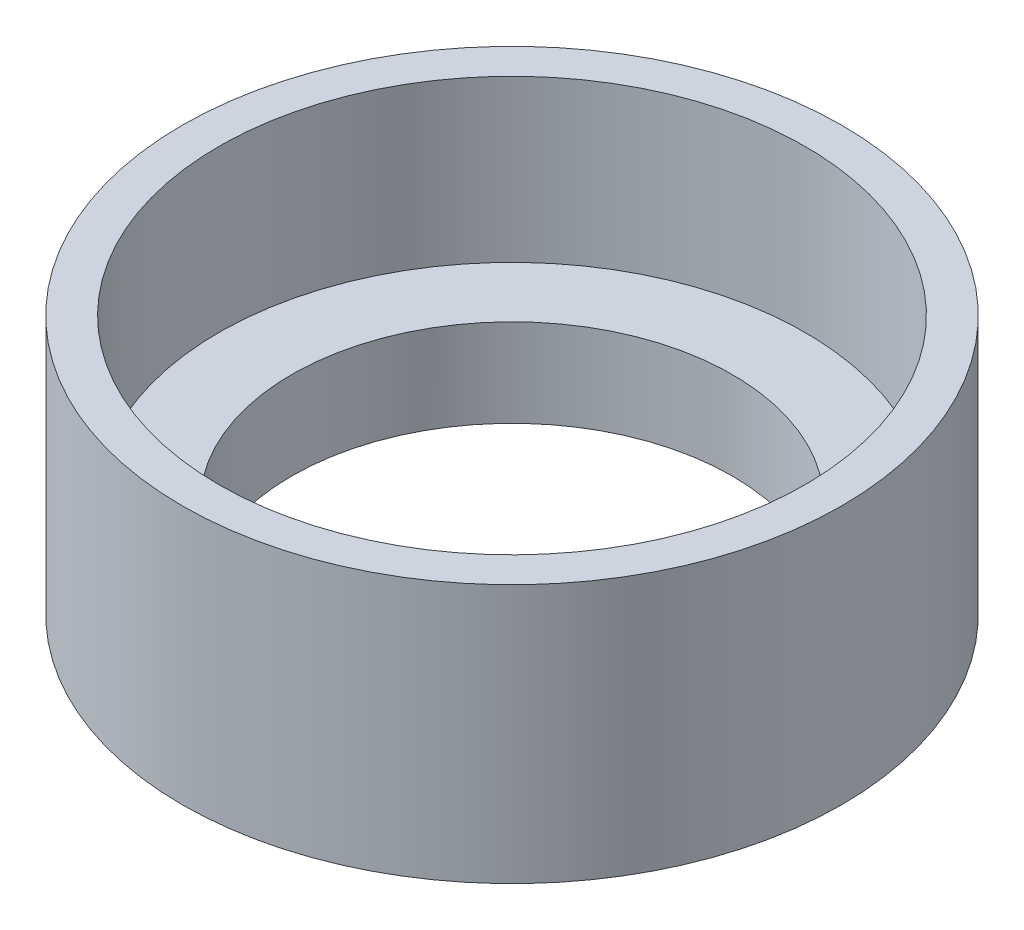
ISO-10303-21;
HEADER;
FILE_DESCRIPTION(('STEP AP214'),'2;1');
FILE_NAME('part.step','',(''),(''),'','','');
FILE_SCHEMA(('AUTOMOTIVE_DESIGN { 1 0 10303 214 1 1 1 1 }'));
ENDSEC;
DATA;
#1=APPLICATION_CONTEXT('core data for automotive mechanical design processes');
#2=APPLICATION_PROTOCOL_DEFINITION('international standard','automotive_design',2000,#1);
#3=PRODUCT_CONTEXT('',#1,'mechanical');
#4=PRODUCT('Part','Part','',(#3));
#5=PRODUCT_RELATED_PRODUCT_CATEGORY('part','',(#4));
#6=PRODUCT_DEFINITION_FORMATION('','',#4);
#7=PRODUCT_DEFINITION_CONTEXT('part definition',#1,'design');
#8=PRODUCT_DEFINITION('design','',#6,#7);
#9=PRODUCT_DEFINITION_SHAPE('','',#8);
#10=(LENGTH_UNIT() NAMED_UNIT(*) SI_UNIT(.MILLI.,.METRE.));
#11=(NAMED_UNIT(*) PLANE_ANGLE_UNIT() SI_UNIT($,.RADIAN.));
#12=(NAMED_UNIT(*) SI_UNIT($,.STERADIAN.) SOLID_ANGLE_UNIT());
#13=UNCERTAINTY_MEASURE_WITH_UNIT(LENGTH_MEASURE(1.E-05),#10,'distance_accuracy_value','');
#14=(GEOMETRIC_REPRESENTATION_CONTEXT(3) GLOBAL_UNCERTAINTY_ASSIGNED_CONTEXT((#13)) GLOBAL_UNIT_ASSIGNED_CONTEXT((#10,
#11,#12)) REPRESENTATION_CONTEXT('',''));
#15=CARTESIAN_POINT('',(0.,0.,0.));
#16=DIRECTION('',(0.,0.,1.));
#17=DIRECTION('',(1.,0.,0.));
#18=AXIS2_PLACEMENT_3D('',#15,#16,#17);
#19=CARTESIAN_POINT('',(0.,20.,0.));
#20=DIRECTION('',(0.,-1.,0.));
#21=DIRECTION('',(0.,0.,-1.));
#22=AXIS2_PLACEMENT_3D('',#19,#20,#21);
#23=PLANE('',#22);
#24=CARTESIAN_POINT('',(0.,20.,0.));
#25=DIRECTION('',(0.,-1.,0.));
#26=DIRECTION('',(0.,0.,-1.));
#27=AXIS2_PLACEMENT_3D('',#24,#25,#26);
#28=CIRCLE('',#27,60.);
#29=CARTESIAN_POINT('',(0.,20.,60.));
#30=VERTEX_POINT('',#29);
#31=EDGE_CURVE('E47',#30,#30,#28,.T.);
#32=ORIENTED_EDGE('',*,*,#31,.F.);
#33=EDGE_LOOP('',(#32));
#34=FACE_BOUND('',#33,.T.);
#35=CARTESIAN_POINT('',(0.,20.,0.));
#36=DIRECTION('',(0.,1.,0.));
#37=DIRECTION('',(0.,0.,1.));
#38=AXIS2_PLACEMENT_3D('',#35,#36,#37);
#39=CIRCLE('',#38,45.1);
#40=CARTESIAN_POINT('',(0.,20.,45.1));
#41=VERTEX_POINT('',#40);
#42=EDGE_CURVE('E72',#41,#41,#39,.T.);
#43=ORIENTED_EDGE('',*,*,#42,.F.);
#44=EDGE_LOOP('',(#43));
#45=FACE_BOUND('',#44,.T.);
#46=ADVANCED_FACE('F40',(#34,#45),#23,.F.);
#47=CARTESIAN_POINT('',(0.,16.,0.));
#48=DIRECTION('',(0.,-1.,0.));
#49=DIRECTION('',(0.,0.,-1.));
#50=AXIS2_PLACEMENT_3D('',#47,#48,#49);
#51=PLANE('',#50);
#52=CARTESIAN_POINT('',(0.,16.,0.));
#53=DIRECTION('',(0.,-1.,0.));
#54=DIRECTION('',(0.,0.,-1.));
#55=AXIS2_PLACEMENT_3D('',#52,#53,#54);
#56=CIRCLE('',#55,47.65);
#57=CARTESIAN_POINT('',(0.,16.,-47.65));
#58=VERTEX_POINT('',#57);
#59=EDGE_CURVE('E10',#58,#58,#56,.T.);
#60=ORIENTED_EDGE('',*,*,#59,.F.);
#61=EDGE_LOOP('',(#60));
#62=FACE_BOUND('',#61,.T.);
#63=CARTESIAN_POINT('',(0.,16.,0.));
#64=DIRECTION('',(0.,-1.,0.));
#65=DIRECTION('',(0.,0.,-1.));
#66=AXIS2_PLACEMENT_3D('',#63,#64,#65);
#67=CIRCLE('',#66,60.);
#68=CARTESIAN_POINT('',(0.,16.,60.));
#69=VERTEX_POINT('',#68);
#70=EDGE_CURVE('E63',#69,#69,#67,.T.);
#71=ORIENTED_EDGE('',*,*,#70,.T.);
#72=EDGE_LOOP('',(#71));
#73=FACE_BOUND('',#72,.T.);
#74=ADVANCED_FACE('F97',(#62,#73),#51,.T.);
#75=CARTESIAN_POINT('',(0.,-176.211009871688,0.));
#76=DIRECTION('',(0.,1.,0.));
#77=DIRECTION('',(0.,0.,1.));
#78=AXIS2_PLACEMENT_3D('',#75,#76,#77);
#79=CYLINDRICAL_SURFACE('',#78,60.);
#80=CARTESIAN_POINT('',(0.,0.,0.));
#81=DIRECTION('',(0.,1.,0.));
#82=DIRECTION('',(0.,0.,1.));
#83=AXIS2_PLACEMENT_3D('',#80,#81,#82);
#84=CIRCLE('',#83,60.);
#85=CARTESIAN_POINT('',(0.,0.,60.));
#86=VERTEX_POINT('',#85);
#87=EDGE_CURVE('E60',#86,#86,#84,.F.);
#88=CARTESIAN_POINT('',(0.,16.,60.));
#89=CARTESIAN_POINT('',(0.,15.8333333333334,60.));
#90=CARTESIAN_POINT('',(0.,15.6666666666667,60.));
#91=CARTESIAN_POINT('',(0.,15.3333333333334,60.));
#92=CARTESIAN_POINT('',(0.,15.1666666666667,60.));
#93=CARTESIAN_POINT('',(0.,14.8333333333334,60.));
#94=CARTESIAN_POINT('',(0.,14.6666666666667,60.));
#95=CARTESIAN_POINT('',(0.,14.3333333333334,60.));
#96=CARTESIAN_POINT('',(0.,14.1666666666667,60.));
#97=CARTESIAN_POINT('',(0.,13.8333333333334,60.));
#98=CARTESIAN_POINT('',(0.,13.6666666666667,60.));
#99=CARTESIAN_POINT('',(0.,13.3333333333334,60.));
#100=CARTESIAN_POINT('',(0.,13.1666666666667,60.));
#101=CARTESIAN_POINT('',(0.,12.8333333333334,60.));
#102=CARTESIAN_POINT('',(0.,12.6666666666667,60.));
#103=CARTESIAN_POINT('',(0.,12.3333333333334,60.));
#104=CARTESIAN_POINT('',(0.,12.1666666666667,60.));
#105=CARTESIAN_POINT('',(0.,11.8333333333334,60.));
#106=CARTESIAN_POINT('',(0.,11.6666666666667,60.));
#107=CARTESIAN_POINT('',(0.,11.3333333333333,60.));
#108=CARTESIAN_POINT('',(0.,11.1666666666667,60.));
#109=CARTESIAN_POINT('',(0.,10.8333333333333,60.));
#110=CARTESIAN_POINT('',(0.,10.6666666666667,60.));
#111=CARTESIAN_POINT('',(0.,10.3333333333333,60.));
#112=CARTESIAN_POINT('',(0.,10.1666666666667,60.));
#113=CARTESIAN_POINT('',(0.,9.83333333333334,60.));
#114=CARTESIAN_POINT('',(0.,9.66666666666667,60.));
#115=CARTESIAN_POINT('',(0.,9.33333333333334,60.));
#116=CARTESIAN_POINT('',(0.,9.16666666666667,60.));
#117=CARTESIAN_POINT('',(0.,8.83333333333334,60.));
#118=CARTESIAN_POINT('',(0.,8.66666666666667,60.));
#119=CARTESIAN_POINT('',(0.,8.33333333333334,60.));
#120=CARTESIAN_POINT('',(0.,8.16666666666667,60.));
#121=CARTESIAN_POINT('',(0.,7.83333333333334,60.));
#122=CARTESIAN_POINT('',(0.,7.66666666666667,60.));
#123=CARTESIAN_POINT('',(0.,7.33333333333334,60.));
#124=CARTESIAN_POINT('',(0.,7.16666666666667,60.));
#125=CARTESIAN_POINT('',(0.,6.83333333333334,60.));
#126=CARTESIAN_POINT('',(0.,6.66666666666667,60.));
#127=CARTESIAN_POINT('',(0.,6.33333333333334,60.));
#128=CARTESIAN_POINT('',(0.,6.16666666666667,60.));
#129=CARTESIAN_POINT('',(0.,5.83333333333334,60.));
#130=CARTESIAN_POINT('',(0.,5.66666666666667,60.));
#131=CARTESIAN_POINT('',(0.,5.33333333333334,60.));
#132=CARTESIAN_POINT('',(0.,5.16666666666667,60.));
#133=CARTESIAN_POINT('',(0.,4.83333333333334,60.));
#134=CARTESIAN_POINT('',(0.,4.66666666666667,60.));
#135=CARTESIAN_POINT('',(0.,4.33333333333333,60.));
#136=CARTESIAN_POINT('',(0.,4.16666666666665,60.));
#137=CARTESIAN_POINT('',(0.,3.83333333333331,60.));
#138=CARTESIAN_POINT('',(0.,3.66666666666664,60.));
#139=CARTESIAN_POINT('',(0.,3.33333333333331,60.));
#140=CARTESIAN_POINT('',(0.,3.16666666666664,60.));
#141=CARTESIAN_POINT('',(0.,2.83333333333331,60.));
#142=CARTESIAN_POINT('',(0.,2.66666666666664,60.));
#143=CARTESIAN_POINT('',(0.,2.33333333333331,60.));
#144=CARTESIAN_POINT('',(0.,2.16666666666664,60.));
#145=CARTESIAN_POINT('',(0.,1.83333333333331,60.));
#146=CARTESIAN_POINT('',(0.,1.66666666666664,60.));
#147=CARTESIAN_POINT('',(0.,1.33333333333331,60.));
#148=CARTESIAN_POINT('',(0.,1.16666666666664,60.));
#149=CARTESIAN_POINT('',(0.,0.833333333333306,60.));
#150=CARTESIAN_POINT('',(0.,0.66666666666664,60.));
#151=CARTESIAN_POINT('',(0.,0.333333333333306,60.));
#152=CARTESIAN_POINT('',(0.,0.166666666666639,60.));
#153=CARTESIAN_POINT('',(0.,0.,60.));
#154=B_SPLINE_CURVE_WITH_KNOTS('',3,(#88,#89,#90,#91,#92,#93,#94,#95,#96,#97,#98,#99,#100,#101,
#102,#103,#104,#105,#106,#107,#108,#109,#110,#111,#112,#113,#114,#115,#116,#117,#118,#119,#120,
#121,#122,#123,#124,#125,#126,#127,#128,#129,#130,#131,#132,#133,#134,#135,#136,#137,#138,#139,
#140,#141,#142,#143,#144,#145,#146,#147,#148,#149,#150,#151,#152,#153),.UNSPECIFIED.,.F.,.F.,(4,
2,2,2,2,2,2,2,2,2,2,2,2,2,2,2,2,2,2,2,2,2,2,2,2,2,2,2,2,2,2,2,4),(0.,0.5,1.,1.5,2.,2.5,3.,3.5,
4.,4.50000000000003,5.00000000000003,5.50000000000003,6.00000000000003,6.50000000000003,
7.00000000000003,7.50000000000003,8.00000000000004,8.50000000000004,9.00000000000004,
9.50000000000004,10.,10.5,11.,11.5,12.0000000000001,12.5000000000001,13.0000000000001,
13.5000000000001,14.0000000000001,14.5000000000001,15.0000000000001,15.5000000000001,
16.0000000000001),.UNSPECIFIED.);
#155=EDGE_CURVE('BSEAM103',#69,#86,#154,.T.);
#156=ORIENTED_EDGE('',*,*,#70,.F.);
#157=ORIENTED_EDGE('',*,*,#87,.T.);
#158=ORIENTED_EDGE('',*,*,#155,.T.);
#159=ORIENTED_EDGE('',*,*,#155,.F.);
#160=EDGE_LOOP('',(#156,#158,#157,#159));
#161=FACE_BOUND('',#160,.T.);
#162=ADVANCED_FACE('F103',(#161),#79,.F.);
#163=CARTESIAN_POINT('',(0.,53.,0.));
#164=DIRECTION('',(0.,1.,0.));
#165=DIRECTION('',(0.,0.,1.));
#166=AXIS2_PLACEMENT_3D('',#163,#164,#165);
#167=CIRCLE('',#166,60.);
#168=CARTESIAN_POINT('',(0.,53.,60.));
#169=VERTEX_POINT('',#168);
#170=EDGE_CURVE('E68',#169,#169,#167,.T.);
#171=CARTESIAN_POINT('',(0.,53.,60.));
#172=CARTESIAN_POINT('',(0.,52.65625,60.));
#173=CARTESIAN_POINT('',(0.,52.3125,60.));
#174=CARTESIAN_POINT('',(0.,51.625,60.));
#175=CARTESIAN_POINT('',(0.,51.28125,60.));
#176=CARTESIAN_POINT('',(0.,50.59375,60.));
#177=CARTESIAN_POINT('',(0.,50.25,60.));
#178=CARTESIAN_POINT('',(0.,49.5625,60.));
#179=CARTESIAN_POINT('',(0.,49.21875,60.));
#180=CARTESIAN_POINT('',(0.,48.53125,60.));
#181=CARTESIAN_POINT('',(0.,48.1875,60.));
#182=CARTESIAN_POINT('',(0.,47.5,60.));
#183=CARTESIAN_POINT('',(0.,47.15625,60.));
#184=CARTESIAN_POINT('',(0.,46.46875,60.));
#185=CARTESIAN_POINT('',(0.,46.125,60.));
#186=CARTESIAN_POINT('',(0.,45.4375,60.));
#187=CARTESIAN_POINT('',(0.,45.09375,60.));
#188=CARTESIAN_POINT('',(0.,44.40625,60.));
#189=CARTESIAN_POINT('',(0.,44.0625,60.));
#190=CARTESIAN_POINT('',(0.,43.375,60.));
#191=CARTESIAN_POINT('',(0.,43.03125,60.));
#192=CARTESIAN_POINT('',(0.,42.34375,60.));
#193=CARTESIAN_POINT('',(0.,42.,60.));
#194=CARTESIAN_POINT('',(0.,41.3125,60.));
#195=CARTESIAN_POINT('',(0.,40.96875,60.));
#196=CARTESIAN_POINT('',(0.,40.28125,60.));
#197=CARTESIAN_POINT('',(0.,39.9375,60.));
#198=CARTESIAN_POINT('',(0.,39.25,60.));
#199=CARTESIAN_POINT('',(0.,38.90625,60.));
#200=CARTESIAN_POINT('',(0.,38.21875,60.));
#201=CARTESIAN_POINT('',(0.,37.875,60.));
#202=CARTESIAN_POINT('',(0.,37.1875,60.));
#203=CARTESIAN_POINT('',(0.,36.84375,60.));
#204=CARTESIAN_POINT('',(0.,36.15625,60.));
#205=CARTESIAN_POINT('',(0.,35.8125,60.));
#206=CARTESIAN_POINT('',(0.,35.125,60.));
#207=CARTESIAN_POINT('',(0.,34.78125,60.));
#208=CARTESIAN_POINT('',(0.,34.09375,60.));
#209=CARTESIAN_POINT('',(0.,33.75,60.));
#210=CARTESIAN_POINT('',(0.,33.0625,60.));
#211=CARTESIAN_POINT('',(0.,32.71875,60.));
#212=CARTESIAN_POINT('',(0.,32.03125,60.));
#213=CARTESIAN_POINT('',(0.,31.6875,60.));
#214=CARTESIAN_POINT('',(0.,31.,60.));
#215=CARTESIAN_POINT('',(0.,30.65625,60.));
#216=CARTESIAN_POINT('',(0.,29.96875,60.));
#217=CARTESIAN_POINT('',(0.,29.625,60.));
#218=CARTESIAN_POINT('',(0.,28.9375,60.));
#219=CARTESIAN_POINT('',(0.,28.59375,60.));
#220=CARTESIAN_POINT('',(0.,27.90625,60.));
#221=CARTESIAN_POINT('',(0.,27.5625,60.));
#222=CARTESIAN_POINT('',(0.,26.875,60.));
#223=CARTESIAN_POINT('',(0.,26.53125,60.));
#224=CARTESIAN_POINT('',(0.,25.84375,60.));
#225=CARTESIAN_POINT('',(0.,25.5,60.));
#226=CARTESIAN_POINT('',(0.,24.8125,60.));
#227=CARTESIAN_POINT('',(0.,24.46875,60.));
#228=CARTESIAN_POINT('',(0.,23.78125,60.));
#229=CARTESIAN_POINT('',(0.,23.4375,60.));
#230=CARTESIAN_POINT('',(0.,22.75,60.));
#231=CARTESIAN_POINT('',(0.,22.40625,60.));
#232=CARTESIAN_POINT('',(0.,21.71875,60.));
#233=CARTESIAN_POINT('',(0.,21.375,60.));
#234=CARTESIAN_POINT('',(0.,20.6875,60.));
#235=CARTESIAN_POINT('',(0.,20.34375,60.));
#236=CARTESIAN_POINT('',(0.,20.,60.));
#237=B_SPLINE_CURVE_WITH_KNOTS('',3,(#171,#172,#173,#174,#175,#176,#177,#178,#179,#180,#181,
#182,#183,#184,#185,#186,#187,#188,#189,#190,#191,#192,#193,#194,#195,#196,#197,#198,#199,#200,
#201,#202,#203,#204,#205,#206,#207,#208,#209,#210,#211,#212,#213,#214,#215,#216,#217,#218,#219,
#220,#221,#222,#223,#224,#225,#226,#227,#228,#229,#230,#231,#232,#233,#234,#235,#236),
.UNSPECIFIED.,.F.,.F.,(4,2,2,2,2,2,2,2,2,2,2,2,2,2,2,2,2,2,2,2,2,2,2,2,2,2,2,2,2,2,2,2,4),(0.,
1.03125000000001,2.06249999999999,3.09375000000001,4.12499999999999,5.15625,6.18750000000001,
7.21875,8.25000000000001,9.28125000000002,10.3125,11.34375,12.375,13.40625,14.4375,15.46875,
16.5,17.53125,18.5625,19.59375,20.625,21.65625,22.6875,23.71875,24.75,25.78125,26.8125,27.84375,
28.875,29.90625,30.9375,31.96875,33.),.UNSPECIFIED.);
#238=EDGE_CURVE('BSEAM111',#169,#30,#237,.T.);
#239=ORIENTED_EDGE('',*,*,#170,.T.);
#240=ORIENTED_EDGE('',*,*,#31,.T.);
#241=ORIENTED_EDGE('',*,*,#238,.T.);
#242=ORIENTED_EDGE('',*,*,#238,.F.);
#243=EDGE_LOOP('',(#239,#241,#240,#242));
#244=FACE_BOUND('',#243,.T.);
#245=ADVANCED_FACE('F111',(#244),#79,.F.);
#246=CARTESIAN_POINT('',(0.,53.,0.));
#247=DIRECTION('',(0.,1.,0.));
#248=DIRECTION('',(0.,0.,1.));
#249=AXIS2_PLACEMENT_3D('',#246,#247,#248);
#250=PLANE('',#249);
#251=CARTESIAN_POINT('',(0.,53.,0.));
#252=DIRECTION('',(0.,1.,0.));
#253=DIRECTION('',(0.,0.,1.));
#254=AXIS2_PLACEMENT_3D('',#251,#252,#253);
#255=CIRCLE('',#254,67.5);
#256=CARTESIAN_POINT('',(0.,53.,67.5));
#257=VERTEX_POINT('',#256);
#258=EDGE_CURVE('E56',#257,#257,#255,.T.);
#259=ORIENTED_EDGE('',*,*,#258,.T.);
#260=EDGE_LOOP('',(#259));
#261=FACE_BOUND('',#260,.T.);
#262=ORIENTED_EDGE('',*,*,#170,.F.);
#263=EDGE_LOOP('',(#262));
#264=FACE_BOUND('',#263,.T.);
#265=ADVANCED_FACE('F108',(#261,#264),#250,.T.);
#266=CARTESIAN_POINT('',(0.,-11.,0.));
#267=DIRECTION('',(0.,1.,0.));
#268=DIRECTION('',(0.,0.,1.));
#269=AXIS2_PLACEMENT_3D('',#266,#267,#268);
#270=CYLINDRICAL_SURFACE('',#269,67.5);
#271=ORIENTED_EDGE('',*,*,#258,.F.);
#272=EDGE_LOOP('',(#271));
#273=FACE_BOUND('',#272,.T.);
#274=CARTESIAN_POINT('',(0.,0.,0.));
#275=DIRECTION('',(0.,1.,0.));
#276=DIRECTION('',(0.,0.,1.));
#277=AXIS2_PLACEMENT_3D('',#274,#275,#276);
#278=CIRCLE('',#277,67.5);
#279=CARTESIAN_POINT('',(0.,0.,67.5));
#280=VERTEX_POINT('',#279);
#281=EDGE_CURVE('E51',#280,#280,#278,.T.);
#282=ORIENTED_EDGE('',*,*,#281,.T.);
#283=EDGE_LOOP('',(#282));
#284=FACE_BOUND('',#283,.T.);
#285=ADVANCED_FACE('F110',(#273,#284),#270,.T.);
#286=CARTESIAN_POINT('',(0.,0.,0.));
#287=DIRECTION('',(0.,1.,0.));
#288=DIRECTION('',(0.,0.,1.));
#289=AXIS2_PLACEMENT_3D('',#286,#287,#288);
#290=PLANE('',#289);
#291=ORIENTED_EDGE('',*,*,#281,.F.);
#292=EDGE_LOOP('',(#291));
#293=FACE_BOUND('',#292,.T.);
#294=ORIENTED_EDGE('',*,*,#87,.F.);
#295=EDGE_LOOP('',(#294));
#296=FACE_BOUND('',#295,.T.);
#297=ADVANCED_FACE('F42',(#293,#296),#290,.F.);
#298=CARTESIAN_POINT('',(0.,3.,0.));
#299=DIRECTION('',(0.,1.,0.));
#300=DIRECTION('',(0.,0.,1.));
#301=AXIS2_PLACEMENT_3D('',#298,#299,#300);
#302=CYLINDRICAL_SURFACE('',#301,45.1);
#303=ORIENTED_EDGE('',*,*,#42,.T.);
#304=EDGE_LOOP('',(#303));
#305=FACE_BOUND('',#304,.T.);
#306=CARTESIAN_POINT('',(0.,2.,0.));
#307=DIRECTION('',(0.,-1.,0.));
#308=DIRECTION('',(0.,0.,-1.));
#309=AXIS2_PLACEMENT_3D('',#306,#307,#308);
#310=CIRCLE('',#309,45.1);
#311=CARTESIAN_POINT('',(0.,2.,-45.1));
#312=VERTEX_POINT('',#311);
#313=EDGE_CURVE('E81',#312,#312,#310,.T.);
#314=ORIENTED_EDGE('',*,*,#313,.T.);
#315=EDGE_LOOP('',(#314));
#316=FACE_BOUND('',#315,.T.);
#317=ADVANCED_FACE('F85',(#305,#316),#302,.F.);
#318=CARTESIAN_POINT('',(0.,150.774552494156,0.));
#319=DIRECTION('',(0.,-1.,0.));
#320=DIRECTION('',(0.,0.,-1.));
#321=AXIS2_PLACEMENT_3D('',#318,#319,#320);
#322=CYLINDRICAL_SURFACE('',#321,47.65);
#323=ORIENTED_EDGE('',*,*,#59,.T.);
#324=EDGE_LOOP('',(#323));
#325=FACE_BOUND('',#324,.T.);
#326=CARTESIAN_POINT('',(0.,2.,0.));
#327=DIRECTION('',(0.,-1.,0.));
#328=DIRECTION('',(0.,0.,-1.));
#329=AXIS2_PLACEMENT_3D('',#326,#327,#328);
#330=CIRCLE('',#329,47.65);
#331=CARTESIAN_POINT('',(0.,2.,-47.65));
#332=VERTEX_POINT('',#331);
#333=EDGE_CURVE('E76',#332,#332,#330,.T.);
#334=ORIENTED_EDGE('',*,*,#333,.F.);
#335=EDGE_LOOP('',(#334));
#336=FACE_BOUND('',#335,.T.);
#337=ADVANCED_FACE('F89',(#325,#336),#322,.T.);
#338=CARTESIAN_POINT('',(0.,2.,0.));
#339=DIRECTION('',(0.,-1.,0.));
#340=DIRECTION('',(0.,0.,-1.));
#341=AXIS2_PLACEMENT_3D('',#338,#339,#340);
#342=PLANE('',#341);
#343=ORIENTED_EDGE('',*,*,#333,.T.);
#344=EDGE_LOOP('',(#343));
#345=FACE_BOUND('',#344,.T.);
#346=ORIENTED_EDGE('',*,*,#313,.F.);
#347=EDGE_LOOP('',(#346));
#348=FACE_BOUND('',#347,.T.);
#349=ADVANCED_FACE('F87',(#345,#348),#342,.T.);
#350=CLOSED_SHELL('',(#46,#74,#162,#245,#265,#285,#297,#317,#337,#349));
#351=MANIFOLD_SOLID_BREP('B2',#350);
#352=ADVANCED_BREP_SHAPE_REPRESENTATION('',(#18,#351),#14);
#353=SHAPE_DEFINITION_REPRESENTATION(#9,#352);
ENDSEC;
END-ISO-10303-21;
